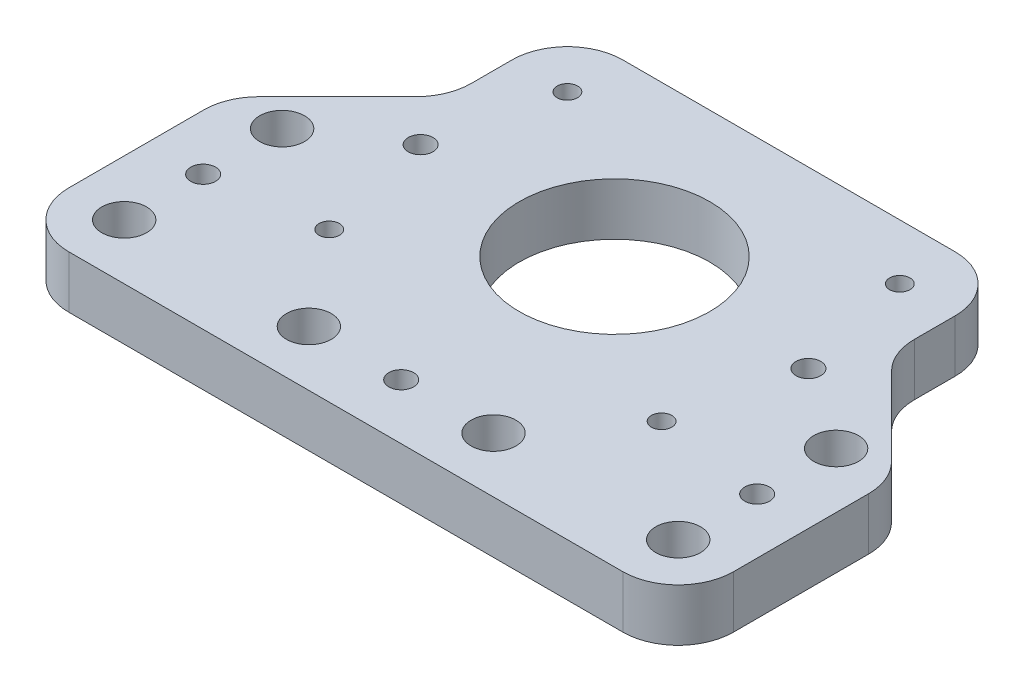
ISO-10303-21;
HEADER;
FILE_DESCRIPTION(('STEP AP214'),'2;1');
FILE_NAME('part.step','',(''),(''),'','','');
FILE_SCHEMA(('AUTOMOTIVE_DESIGN { 1 0 10303 214 1 1 1 1 }'));
ENDSEC;
DATA;
#1=APPLICATION_CONTEXT('core data for automotive mechanical design processes');
#2=APPLICATION_PROTOCOL_DEFINITION('international standard','automotive_design',2000,#1);
#3=PRODUCT_CONTEXT('',#1,'mechanical');
#4=PRODUCT('Part','Part','',(#3));
#5=PRODUCT_RELATED_PRODUCT_CATEGORY('part','',(#4));
#6=PRODUCT_DEFINITION_FORMATION('','',#4);
#7=PRODUCT_DEFINITION_CONTEXT('part definition',#1,'design');
#8=PRODUCT_DEFINITION('design','',#6,#7);
#9=PRODUCT_DEFINITION_SHAPE('','',#8);
#10=(LENGTH_UNIT() NAMED_UNIT(*) SI_UNIT(.MILLI.,.METRE.));
#11=(NAMED_UNIT(*) PLANE_ANGLE_UNIT() SI_UNIT($,.RADIAN.));
#12=(NAMED_UNIT(*) SI_UNIT($,.STERADIAN.) SOLID_ANGLE_UNIT());
#13=UNCERTAINTY_MEASURE_WITH_UNIT(LENGTH_MEASURE(1.E-05),#10,'distance_accuracy_value','');
#14=(GEOMETRIC_REPRESENTATION_CONTEXT(3) GLOBAL_UNCERTAINTY_ASSIGNED_CONTEXT((#13)) GLOBAL_UNIT_ASSIGNED_CONTEXT((#10,
#11,#12)) REPRESENTATION_CONTEXT('',''));
#15=CARTESIAN_POINT('',(0.,0.,0.));
#16=DIRECTION('',(0.,0.,1.));
#17=DIRECTION('',(1.,0.,0.));
#18=AXIS2_PLACEMENT_3D('',#15,#16,#17);
#19=CARTESIAN_POINT('',(0.,6.,-50.8));
#20=DIRECTION('',(0.,-1.,0.));
#21=DIRECTION('',(0.,0.,-1.));
#22=AXIS2_PLACEMENT_3D('',#19,#20,#21);
#23=PLANE('',#22);
#24=CARTESIAN_POINT('',(6.34999999999999,6.,-15.40002));
#25=DIRECTION('',(0.,-1.,0.));
#26=DIRECTION('',(0.,0.,-1.));
#27=AXIS2_PLACEMENT_3D('',#24,#25,#26);
#28=CIRCLE('',#27,1.42);
#29=CARTESIAN_POINT('',(6.34999999999999,6.,-16.82002));
#30=VERTEX_POINT('',#29);
#31=EDGE_CURVE('E276',#30,#30,#28,.T.);
#32=ORIENTED_EDGE('',*,*,#31,.T.);
#33=EDGE_LOOP('',(#32));
#34=FACE_BOUND('',#33,.T.);
#35=CARTESIAN_POINT('',(38.1,6.,-6.34999999999996));
#36=DIRECTION('',(0.,-1.,0.));
#37=DIRECTION('',(0.,0.,-1.));
#38=AXIS2_PLACEMENT_3D('',#35,#36,#37);
#39=CIRCLE('',#38,1.42);
#40=CARTESIAN_POINT('',(38.1,6.,-7.76999999999996));
#41=VERTEX_POINT('',#40);
#42=EDGE_CURVE('E283',#41,#41,#39,.T.);
#43=ORIENTED_EDGE('',*,*,#42,.T.);
#44=EDGE_LOOP('',(#43));
#45=FACE_BOUND('',#44,.T.);
#46=CARTESIAN_POINT('',(69.85,6.,-15.40002));
#47=DIRECTION('',(0.,-1.,0.));
#48=DIRECTION('',(0.,0.,-1.));
#49=AXIS2_PLACEMENT_3D('',#46,#47,#48);
#50=CIRCLE('',#49,1.42);
#51=CARTESIAN_POINT('',(69.85,6.,-16.82002));
#52=VERTEX_POINT('',#51);
#53=EDGE_CURVE('E289',#52,#52,#50,.T.);
#54=ORIENTED_EDGE('',*,*,#53,.T.);
#55=EDGE_LOOP('',(#54));
#56=FACE_BOUND('',#55,.T.);
#57=CARTESIAN_POINT('',(6.34999999999999,6.,-24.45004));
#58=DIRECTION('',(0.,-1.,0.));
#59=DIRECTION('',(0.,0.,-1.));
#60=AXIS2_PLACEMENT_3D('',#57,#58,#59);
#61=CIRCLE('',#60,2.57);
#62=CARTESIAN_POINT('',(6.34999999999999,6.,-27.02004));
#63=VERTEX_POINT('',#62);
#64=EDGE_CURVE('E295',#63,#63,#61,.T.);
#65=ORIENTED_EDGE('',*,*,#64,.T.);
#66=EDGE_LOOP('',(#65));
#67=FACE_BOUND('',#66,.T.);
#68=CARTESIAN_POINT('',(6.34999999999999,6.,-6.35));
#69=DIRECTION('',(0.,-1.,0.));
#70=DIRECTION('',(0.,0.,-1.));
#71=AXIS2_PLACEMENT_3D('',#68,#69,#70);
#72=CIRCLE('',#71,2.57);
#73=CARTESIAN_POINT('',(6.34999999999999,6.,-8.92));
#74=VERTEX_POINT('',#73);
#75=EDGE_CURVE('E302',#74,#74,#72,.T.);
#76=ORIENTED_EDGE('',*,*,#75,.T.);
#77=EDGE_LOOP('',(#76));
#78=FACE_BOUND('',#77,.T.);
#79=CARTESIAN_POINT('',(27.5166666666667,6.,-6.35));
#80=DIRECTION('',(0.,-1.,0.));
#81=DIRECTION('',(0.,0.,-1.));
#82=AXIS2_PLACEMENT_3D('',#79,#80,#81);
#83=CIRCLE('',#82,2.57);
#84=CARTESIAN_POINT('',(27.5166666666667,6.,-8.92));
#85=VERTEX_POINT('',#84);
#86=EDGE_CURVE('E308',#85,#85,#83,.T.);
#87=ORIENTED_EDGE('',*,*,#86,.T.);
#88=EDGE_LOOP('',(#87));
#89=FACE_BOUND('',#88,.T.);
#90=CARTESIAN_POINT('',(48.6833333333333,6.,-6.35));
#91=DIRECTION('',(0.,-1.,0.));
#92=DIRECTION('',(0.,0.,-1.));
#93=AXIS2_PLACEMENT_3D('',#90,#91,#92);
#94=CIRCLE('',#93,2.57);
#95=CARTESIAN_POINT('',(48.6833333333333,6.,-8.92));
#96=VERTEX_POINT('',#95);
#97=EDGE_CURVE('E314',#96,#96,#94,.T.);
#98=ORIENTED_EDGE('',*,*,#97,.T.);
#99=EDGE_LOOP('',(#98));
#100=FACE_BOUND('',#99,.T.);
#101=CARTESIAN_POINT('',(69.85,6.,-6.35));
#102=DIRECTION('',(0.,-1.,0.));
#103=DIRECTION('',(0.,0.,-1.));
#104=AXIS2_PLACEMENT_3D('',#101,#102,#103);
#105=CIRCLE('',#104,2.57);
#106=CARTESIAN_POINT('',(69.85,6.,-8.92));
#107=VERTEX_POINT('',#106);
#108=EDGE_CURVE('E320',#107,#107,#105,.T.);
#109=ORIENTED_EDGE('',*,*,#108,.T.);
#110=EDGE_LOOP('',(#109));
#111=FACE_BOUND('',#110,.T.);
#112=CARTESIAN_POINT('',(69.85,6.,-24.45004));
#113=DIRECTION('',(0.,-1.,0.));
#114=DIRECTION('',(0.,0.,-1.));
#115=AXIS2_PLACEMENT_3D('',#112,#113,#114);
#116=CIRCLE('',#115,2.57);
#117=CARTESIAN_POINT('',(69.85,6.,-27.02004));
#118=VERTEX_POINT('',#117);
#119=EDGE_CURVE('E326',#118,#118,#116,.T.);
#120=ORIENTED_EDGE('',*,*,#119,.T.);
#121=EDGE_LOOP('',(#120));
#122=FACE_BOUND('',#121,.T.);
#123=CARTESIAN_POINT('',(57.15,6.,-17.15));
#124=DIRECTION('',(0.,-1.,0.));
#125=DIRECTION('',(0.,0.,-1.));
#126=AXIS2_PLACEMENT_3D('',#123,#124,#125);
#127=CIRCLE('',#126,1.17);
#128=CARTESIAN_POINT('',(57.15,6.,-18.32));
#129=VERTEX_POINT('',#128);
#130=EDGE_CURVE('E332',#129,#129,#127,.T.);
#131=ORIENTED_EDGE('',*,*,#130,.T.);
#132=EDGE_LOOP('',(#131));
#133=FACE_BOUND('',#132,.T.);
#134=CARTESIAN_POINT('',(19.05,6.,-17.15));
#135=DIRECTION('',(0.,-1.,0.));
#136=DIRECTION('',(0.,0.,-1.));
#137=AXIS2_PLACEMENT_3D('',#134,#135,#136);
#138=CIRCLE('',#137,1.17);
#139=CARTESIAN_POINT('',(19.05,6.,-18.32));
#140=VERTEX_POINT('',#139);
#141=EDGE_CURVE('E338',#140,#140,#138,.T.);
#142=ORIENTED_EDGE('',*,*,#141,.T.);
#143=EDGE_LOOP('',(#142));
#144=FACE_BOUND('',#143,.T.);
#145=CARTESIAN_POINT('',(19.05,6.,-44.45));
#146=DIRECTION('',(0.,-1.,0.));
#147=DIRECTION('',(0.,0.,-1.));
#148=AXIS2_PLACEMENT_3D('',#145,#146,#147);
#149=CIRCLE('',#148,1.17);
#150=CARTESIAN_POINT('',(19.05,6.,-45.62));
#151=VERTEX_POINT('',#150);
#152=EDGE_CURVE('E344',#151,#151,#149,.T.);
#153=ORIENTED_EDGE('',*,*,#152,.T.);
#154=EDGE_LOOP('',(#153));
#155=FACE_BOUND('',#154,.T.);
#156=CARTESIAN_POINT('',(57.15,6.,-44.45));
#157=DIRECTION('',(0.,-1.,0.));
#158=DIRECTION('',(0.,0.,-1.));
#159=AXIS2_PLACEMENT_3D('',#156,#157,#158);
#160=CIRCLE('',#159,1.17);
#161=CARTESIAN_POINT('',(57.15,6.,-45.62));
#162=VERTEX_POINT('',#161);
#163=EDGE_CURVE('E350',#162,#162,#160,.T.);
#164=ORIENTED_EDGE('',*,*,#163,.T.);
#165=EDGE_LOOP('',(#164));
#166=FACE_BOUND('',#165,.T.);
#167=CARTESIAN_POINT('',(60.325,6.,-30.8));
#168=DIRECTION('',(0.,-1.,0.));
#169=DIRECTION('',(0.,0.,-1.));
#170=AXIS2_PLACEMENT_3D('',#167,#168,#169);
#171=CIRCLE('',#170,1.42);
#172=CARTESIAN_POINT('',(60.325,6.,-32.22));
#173=VERTEX_POINT('',#172);
#174=EDGE_CURVE('E353',#173,#173,#171,.F.);
#175=ORIENTED_EDGE('',*,*,#174,.F.);
#176=EDGE_LOOP('',(#175));
#177=FACE_BOUND('',#176,.T.);
#178=CARTESIAN_POINT('',(15.875,6.,-30.8));
#179=DIRECTION('',(0.,-1.,0.));
#180=DIRECTION('',(0.,0.,-1.));
#181=AXIS2_PLACEMENT_3D('',#178,#179,#180);
#182=CIRCLE('',#181,1.42);
#183=CARTESIAN_POINT('',(15.875,6.,-32.22));
#184=VERTEX_POINT('',#183);
#185=EDGE_CURVE('E39',#184,#184,#182,.F.);
#186=ORIENTED_EDGE('',*,*,#185,.F.);
#187=EDGE_LOOP('',(#186));
#188=FACE_BOUND('',#187,.T.);
#189=DIRECTION('',(0.707106781186549,0.,-0.707106781186546));
#190=VECTOR('',#189,1.);
#191=CARTESIAN_POINT('',(12.7,6.,-37.15));
#192=LINE('',#191,#190);
#193=CARTESIAN_POINT('',(1.85987193946543,6.,-26.3098719394655));
#194=VERTEX_POINT('',#193);
#195=CARTESIAN_POINT('',(10.8401280605346,6.,-35.2901280605346));
#196=VERTEX_POINT('',#195);
#197=EDGE_CURVE('E168',#194,#196,#192,.T.);
#198=ORIENTED_EDGE('',*,*,#197,.F.);
#199=CARTESIAN_POINT('',(6.35,6.,-21.8197438789309));
#200=DIRECTION('',(0.,-1.,0.));
#201=DIRECTION('',(0.,0.,-1.));
#202=AXIS2_PLACEMENT_3D('',#199,#200,#201);
#203=CIRCLE('',#202,6.35);
#204=CARTESIAN_POINT('',(0.,6.,-21.8197438789309));
#205=VERTEX_POINT('',#204);
#206=EDGE_CURVE('E151',#194,#205,#203,.F.);
#207=ORIENTED_EDGE('',*,*,#206,.T.);
#208=DIRECTION('',(0.,0.,1.));
#209=VECTOR('',#208,1.);
#210=CARTESIAN_POINT('',(0.,6.,0.));
#211=LINE('',#210,#209);
#212=CARTESIAN_POINT('',(0.,6.,-6.35));
#213=VERTEX_POINT('',#212);
#214=EDGE_CURVE('E190',#205,#213,#211,.T.);
#215=ORIENTED_EDGE('',*,*,#214,.T.);
#216=CARTESIAN_POINT('',(6.35,6.,-6.35));
#217=DIRECTION('',(0.,-1.,0.));
#218=DIRECTION('',(0.,0.,-1.));
#219=AXIS2_PLACEMENT_3D('',#216,#217,#218);
#220=CIRCLE('',#219,6.35);
#221=CARTESIAN_POINT('',(6.35,6.,0.));
#222=VERTEX_POINT('',#221);
#223=EDGE_CURVE('E172',#213,#222,#220,.F.);
#224=ORIENTED_EDGE('',*,*,#223,.T.);
#225=DIRECTION('',(1.,0.,0.));
#226=VECTOR('',#225,1.);
#227=CARTESIAN_POINT('',(0.,6.,0.));
#228=LINE('',#227,#226);
#229=CARTESIAN_POINT('',(69.85,6.,0.));
#230=VERTEX_POINT('',#229);
#231=EDGE_CURVE('E192',#222,#230,#228,.T.);
#232=ORIENTED_EDGE('',*,*,#231,.T.);
#233=CARTESIAN_POINT('',(69.85,6.,-6.35));
#234=DIRECTION('',(0.,-1.,0.));
#235=DIRECTION('',(0.,0.,-1.));
#236=AXIS2_PLACEMENT_3D('',#233,#234,#235);
#237=CIRCLE('',#236,6.35);
#238=CARTESIAN_POINT('',(76.2,6.,-6.35));
#239=VERTEX_POINT('',#238);
#240=EDGE_CURVE('E216',#230,#239,#237,.F.);
#241=ORIENTED_EDGE('',*,*,#240,.T.);
#242=DIRECTION('',(0.,0.,-1.));
#243=VECTOR('',#242,1.);
#244=CARTESIAN_POINT('',(76.2,6.,-50.8));
#245=LINE('',#244,#243);
#246=CARTESIAN_POINT('',(76.2,6.,-21.8197438789309));
#247=VERTEX_POINT('',#246);
#248=EDGE_CURVE('E196',#239,#247,#245,.T.);
#249=ORIENTED_EDGE('',*,*,#248,.T.);
#250=CARTESIAN_POINT('',(69.85,6.,-21.8197438789309));
#251=DIRECTION('',(0.,-1.,0.));
#252=DIRECTION('',(0.,0.,-1.));
#253=AXIS2_PLACEMENT_3D('',#250,#251,#252);
#254=CIRCLE('',#253,6.35);
#255=CARTESIAN_POINT('',(74.3401280605346,6.,-26.3098719394655));
#256=VERTEX_POINT('',#255);
#257=EDGE_CURVE('E162',#247,#256,#254,.F.);
#258=ORIENTED_EDGE('',*,*,#257,.T.);
#259=DIRECTION('',(0.707106781186549,0.,0.707106781186546));
#260=VECTOR('',#259,1.);
#261=CARTESIAN_POINT('',(76.2,6.,-24.4500000000001));
#262=LINE('',#261,#260);
#263=CARTESIAN_POINT('',(65.3598719394654,6.,-35.2901280605346));
#264=VERTEX_POINT('',#263);
#265=EDGE_CURVE('E550',#264,#256,#262,.T.);
#266=ORIENTED_EDGE('',*,*,#265,.F.);
#267=CARTESIAN_POINT('',(69.85,6.,-39.7802561210692));
#268=DIRECTION('',(0.,-1.,0.));
#269=DIRECTION('',(0.,0.,-1.));
#270=AXIS2_PLACEMENT_3D('',#267,#268,#269);
#271=CIRCLE('',#270,6.35);
#272=CARTESIAN_POINT('',(63.5,6.,-39.7802561210692));
#273=VERTEX_POINT('',#272);
#274=EDGE_CURVE('E44',#264,#273,#271,.T.);
#275=ORIENTED_EDGE('',*,*,#274,.T.);
#276=DIRECTION('',(0.,0.,1.));
#277=VECTOR('',#276,1.);
#278=CARTESIAN_POINT('',(63.5,6.,-50.8));
#279=LINE('',#278,#277);
#280=CARTESIAN_POINT('',(63.5,6.,-44.45));
#281=VERTEX_POINT('',#280);
#282=EDGE_CURVE('E292',#281,#273,#279,.T.);
#283=ORIENTED_EDGE('',*,*,#282,.F.);
#284=CARTESIAN_POINT('',(57.15,6.,-44.45));
#285=DIRECTION('',(0.,-1.,0.));
#286=DIRECTION('',(0.,0.,-1.));
#287=AXIS2_PLACEMENT_3D('',#284,#285,#286);
#288=CIRCLE('',#287,6.35);
#289=CARTESIAN_POINT('',(57.15,6.,-50.8));
#290=VERTEX_POINT('',#289);
#291=EDGE_CURVE('E220',#281,#290,#288,.F.);
#292=ORIENTED_EDGE('',*,*,#291,.T.);
#293=DIRECTION('',(-1.,0.,0.));
#294=VECTOR('',#293,1.);
#295=CARTESIAN_POINT('',(38.1,6.,-50.8));
#296=LINE('',#295,#294);
#297=CARTESIAN_POINT('',(19.05,6.,-50.8));
#298=VERTEX_POINT('',#297);
#299=EDGE_CURVE('E199',#290,#298,#296,.T.);
#300=ORIENTED_EDGE('',*,*,#299,.T.);
#301=CARTESIAN_POINT('',(19.05,6.,-44.45));
#302=DIRECTION('',(0.,-1.,0.));
#303=DIRECTION('',(0.,0.,-1.));
#304=AXIS2_PLACEMENT_3D('',#301,#302,#303);
#305=CIRCLE('',#304,6.35);
#306=CARTESIAN_POINT('',(12.7,6.,-44.45));
#307=VERTEX_POINT('',#306);
#308=EDGE_CURVE('E218',#298,#307,#305,.F.);
#309=ORIENTED_EDGE('',*,*,#308,.T.);
#310=DIRECTION('',(0.,0.,-1.));
#311=VECTOR('',#310,1.);
#312=CARTESIAN_POINT('',(12.7,6.,-50.8));
#313=LINE('',#312,#311);
#314=CARTESIAN_POINT('',(12.7,6.,-39.7802561210692));
#315=VERTEX_POINT('',#314);
#316=EDGE_CURVE('E178',#315,#307,#313,.T.);
#317=ORIENTED_EDGE('',*,*,#316,.F.);
#318=CARTESIAN_POINT('',(6.35,6.,-39.7802561210692));
#319=DIRECTION('',(0.,-1.,0.));
#320=DIRECTION('',(0.,0.,-1.));
#321=AXIS2_PLACEMENT_3D('',#318,#319,#320);
#322=CIRCLE('',#321,6.35);
#323=EDGE_CURVE('E177',#315,#196,#322,.T.);
#324=ORIENTED_EDGE('',*,*,#323,.T.);
#325=EDGE_LOOP('',(#198,#207,#215,#224,#232,#241,#249,#258,#266,#275,#283,#292,#300,#309,#317,#324));
#326=FACE_BOUND('',#325,.T.);
#327=CARTESIAN_POINT('',(38.1,6.,-30.8));
#328=DIRECTION('',(0.,-1.,0.));
#329=DIRECTION('',(0.,0.,-1.));
#330=AXIS2_PLACEMENT_3D('',#327,#328,#329);
#331=CIRCLE('',#330,10.92);
#332=CARTESIAN_POINT('',(38.1,6.,-41.72));
#333=VERTEX_POINT('',#332);
#334=EDGE_CURVE('E206',#333,#333,#331,.F.);
#335=ORIENTED_EDGE('',*,*,#334,.F.);
#336=EDGE_LOOP('',(#335));
#337=FACE_BOUND('',#336,.T.);
#338=ADVANCED_FACE('F35',(#34,#45,#56,#67,#78,#89,#100,#111,#122,#133,#144,#155,#166,#177,#188,
#326,#337),#23,.F.);
#339=CARTESIAN_POINT('',(0.,0.,-50.8));
#340=DIRECTION('',(0.,-1.,0.));
#341=DIRECTION('',(0.,0.,-1.));
#342=AXIS2_PLACEMENT_3D('',#339,#340,#341);
#343=PLANE('',#342);
#344=CARTESIAN_POINT('',(6.34999999999999,0.,-15.40002));
#345=DIRECTION('',(0.,-1.,0.));
#346=DIRECTION('',(0.,0.,-1.));
#347=AXIS2_PLACEMENT_3D('',#344,#345,#346);
#348=CIRCLE('',#347,1.42);
#349=CARTESIAN_POINT('',(6.34999999999999,0.,-16.82002));
#350=VERTEX_POINT('',#349);
#351=EDGE_CURVE('E280',#350,#350,#348,.T.);
#352=ORIENTED_EDGE('',*,*,#351,.F.);
#353=EDGE_LOOP('',(#352));
#354=FACE_BOUND('',#353,.T.);
#355=CARTESIAN_POINT('',(38.1,0.,-6.34999999999996));
#356=DIRECTION('',(0.,-1.,0.));
#357=DIRECTION('',(0.,0.,-1.));
#358=AXIS2_PLACEMENT_3D('',#355,#356,#357);
#359=CIRCLE('',#358,1.42);
#360=CARTESIAN_POINT('',(38.1,0.,-7.76999999999996));
#361=VERTEX_POINT('',#360);
#362=EDGE_CURVE('E279',#361,#361,#359,.T.);
#363=ORIENTED_EDGE('',*,*,#362,.F.);
#364=EDGE_LOOP('',(#363));
#365=FACE_BOUND('',#364,.T.);
#366=CARTESIAN_POINT('',(69.85,0.,-15.40002));
#367=DIRECTION('',(0.,-1.,0.));
#368=DIRECTION('',(0.,0.,-1.));
#369=AXIS2_PLACEMENT_3D('',#366,#367,#368);
#370=CIRCLE('',#369,1.42);
#371=CARTESIAN_POINT('',(69.85,0.,-16.82002));
#372=VERTEX_POINT('',#371);
#373=EDGE_CURVE('E286',#372,#372,#370,.T.);
#374=ORIENTED_EDGE('',*,*,#373,.F.);
#375=EDGE_LOOP('',(#374));
#376=FACE_BOUND('',#375,.T.);
#377=DIRECTION('',(0.,0.,1.));
#378=VECTOR('',#377,1.);
#379=CARTESIAN_POINT('',(0.,0.,0.));
#380=LINE('',#379,#378);
#381=CARTESIAN_POINT('',(0.,0.,-21.8197438789309));
#382=VERTEX_POINT('',#381);
#383=CARTESIAN_POINT('',(0.,0.,-6.35));
#384=VERTEX_POINT('',#383);
#385=EDGE_CURVE('E202',#382,#384,#380,.T.);
#386=ORIENTED_EDGE('',*,*,#385,.F.);
#387=CARTESIAN_POINT('',(6.35,0.,-21.8197438789309));
#388=DIRECTION('',(0.,-1.,0.));
#389=DIRECTION('',(0.,0.,-1.));
#390=AXIS2_PLACEMENT_3D('',#387,#388,#389);
#391=CIRCLE('',#390,6.35);
#392=CARTESIAN_POINT('',(1.85987193946543,0.,-26.3098719394655));
#393=VERTEX_POINT('',#392);
#394=EDGE_CURVE('E234',#382,#393,#391,.T.);
#395=ORIENTED_EDGE('',*,*,#394,.T.);
#396=DIRECTION('',(0.707106781186549,0.,-0.707106781186546));
#397=VECTOR('',#396,1.);
#398=CARTESIAN_POINT('',(12.7,0.,-37.15));
#399=LINE('',#398,#397);
#400=CARTESIAN_POINT('',(10.8401280605346,0.,-35.2901280605346));
#401=VERTEX_POINT('',#400);
#402=EDGE_CURVE('E171',#393,#401,#399,.T.);
#403=ORIENTED_EDGE('',*,*,#402,.T.);
#404=CARTESIAN_POINT('',(6.35,0.,-39.7802561210692));
#405=DIRECTION('',(0.,-1.,0.));
#406=DIRECTION('',(0.,0.,-1.));
#407=AXIS2_PLACEMENT_3D('',#404,#405,#406);
#408=CIRCLE('',#407,6.35);
#409=CARTESIAN_POINT('',(12.7,0.,-39.7802561210692));
#410=VERTEX_POINT('',#409);
#411=EDGE_CURVE('E267',#401,#410,#408,.F.);
#412=ORIENTED_EDGE('',*,*,#411,.T.);
#413=DIRECTION('',(0.,0.,-1.));
#414=VECTOR('',#413,1.);
#415=CARTESIAN_POINT('',(12.7,0.,-50.8));
#416=LINE('',#415,#414);
#417=CARTESIAN_POINT('',(12.7,0.,-44.45));
#418=VERTEX_POINT('',#417);
#419=EDGE_CURVE('E187',#410,#418,#416,.T.);
#420=ORIENTED_EDGE('',*,*,#419,.T.);
#421=CARTESIAN_POINT('',(19.05,0.,-44.45));
#422=DIRECTION('',(0.,-1.,0.));
#423=DIRECTION('',(0.,0.,-1.));
#424=AXIS2_PLACEMENT_3D('',#421,#422,#423);
#425=CIRCLE('',#424,6.35);
#426=CARTESIAN_POINT('',(19.05,0.,-50.8));
#427=VERTEX_POINT('',#426);
#428=EDGE_CURVE('E229',#418,#427,#425,.T.);
#429=ORIENTED_EDGE('',*,*,#428,.T.);
#430=DIRECTION('',(-1.,0.,0.));
#431=VECTOR('',#430,1.);
#432=CARTESIAN_POINT('',(0.,0.,-50.8));
#433=LINE('',#432,#431);
#434=CARTESIAN_POINT('',(57.15,0.,-50.8));
#435=VERTEX_POINT('',#434);
#436=EDGE_CURVE('E193',#435,#427,#433,.T.);
#437=ORIENTED_EDGE('',*,*,#436,.F.);
#438=CARTESIAN_POINT('',(57.15,0.,-44.45));
#439=DIRECTION('',(0.,-1.,0.));
#440=DIRECTION('',(0.,0.,-1.));
#441=AXIS2_PLACEMENT_3D('',#438,#439,#440);
#442=CIRCLE('',#441,6.35);
#443=CARTESIAN_POINT('',(63.5,0.,-44.45));
#444=VERTEX_POINT('',#443);
#445=EDGE_CURVE('E59',#435,#444,#442,.T.);
#446=ORIENTED_EDGE('',*,*,#445,.T.);
#447=DIRECTION('',(0.,0.,1.));
#448=VECTOR('',#447,1.);
#449=CARTESIAN_POINT('',(63.5,0.,-50.8));
#450=LINE('',#449,#448);
#451=CARTESIAN_POINT('',(63.5,0.,-39.7802561210692));
#452=VERTEX_POINT('',#451);
#453=EDGE_CURVE('E184',#444,#452,#450,.T.);
#454=ORIENTED_EDGE('',*,*,#453,.T.);
#455=CARTESIAN_POINT('',(69.85,0.,-39.7802561210692));
#456=DIRECTION('',(0.,-1.,0.));
#457=DIRECTION('',(0.,0.,-1.));
#458=AXIS2_PLACEMENT_3D('',#455,#456,#457);
#459=CIRCLE('',#458,6.35);
#460=CARTESIAN_POINT('',(65.3598719394654,0.,-35.2901280605346));
#461=VERTEX_POINT('',#460);
#462=EDGE_CURVE('E12',#452,#461,#459,.F.);
#463=ORIENTED_EDGE('',*,*,#462,.T.);
#464=DIRECTION('',(0.707106781186549,0.,0.707106781186546));
#465=VECTOR('',#464,1.);
#466=CARTESIAN_POINT('',(76.2,0.,-24.4500000000001));
#467=LINE('',#466,#465);
#468=CARTESIAN_POINT('',(74.3401280605346,0.,-26.3098719394655));
#469=VERTEX_POINT('',#468);
#470=EDGE_CURVE('E179',#461,#469,#467,.T.);
#471=ORIENTED_EDGE('',*,*,#470,.T.);
#472=CARTESIAN_POINT('',(69.85,0.,-21.8197438789309));
#473=DIRECTION('',(0.,-1.,0.));
#474=DIRECTION('',(0.,0.,-1.));
#475=AXIS2_PLACEMENT_3D('',#472,#473,#474);
#476=CIRCLE('',#475,6.35);
#477=CARTESIAN_POINT('',(76.2,0.,-21.8197438789309));
#478=VERTEX_POINT('',#477);
#479=EDGE_CURVE('E232',#469,#478,#476,.T.);
#480=ORIENTED_EDGE('',*,*,#479,.T.);
#481=DIRECTION('',(0.,0.,-1.));
#482=VECTOR('',#481,1.);
#483=CARTESIAN_POINT('',(76.2,0.,-50.8));
#484=LINE('',#483,#482);
#485=CARTESIAN_POINT('',(76.2,0.,-6.35));
#486=VERTEX_POINT('',#485);
#487=EDGE_CURVE('E209',#486,#478,#484,.T.);
#488=ORIENTED_EDGE('',*,*,#487,.F.);
#489=CARTESIAN_POINT('',(69.85,0.,-6.35));
#490=DIRECTION('',(0.,-1.,0.));
#491=DIRECTION('',(0.,0.,-1.));
#492=AXIS2_PLACEMENT_3D('',#489,#490,#491);
#493=CIRCLE('',#492,6.35);
#494=CARTESIAN_POINT('',(69.85,0.,0.));
#495=VERTEX_POINT('',#494);
#496=EDGE_CURVE('E227',#486,#495,#493,.T.);
#497=ORIENTED_EDGE('',*,*,#496,.T.);
#498=DIRECTION('',(1.,0.,0.));
#499=VECTOR('',#498,1.);
#500=CARTESIAN_POINT('',(0.,0.,0.));
#501=LINE('',#500,#499);
#502=CARTESIAN_POINT('',(6.35,0.,0.));
#503=VERTEX_POINT('',#502);
#504=EDGE_CURVE('E205',#503,#495,#501,.T.);
#505=ORIENTED_EDGE('',*,*,#504,.F.);
#506=CARTESIAN_POINT('',(6.35,0.,-6.35));
#507=DIRECTION('',(0.,-1.,0.));
#508=DIRECTION('',(0.,0.,-1.));
#509=AXIS2_PLACEMENT_3D('',#506,#507,#508);
#510=CIRCLE('',#509,6.35);
#511=EDGE_CURVE('E225',#503,#384,#510,.T.);
#512=ORIENTED_EDGE('',*,*,#511,.T.);
#513=EDGE_LOOP('',(#386,#395,#403,#412,#420,#429,#437,#446,#454,#463,#471,#480,#488,#497,#505,#512));
#514=FACE_BOUND('',#513,.T.);
#515=CARTESIAN_POINT('',(6.34999999999999,0.,-24.45004));
#516=DIRECTION('',(0.,-1.,0.));
#517=DIRECTION('',(0.,0.,-1.));
#518=AXIS2_PLACEMENT_3D('',#515,#516,#517);
#519=CIRCLE('',#518,2.57);
#520=CARTESIAN_POINT('',(6.34999999999999,0.,-27.02004));
#521=VERTEX_POINT('',#520);
#522=EDGE_CURVE('E299',#521,#521,#519,.T.);
#523=ORIENTED_EDGE('',*,*,#522,.F.);
#524=EDGE_LOOP('',(#523));
#525=FACE_BOUND('',#524,.T.);
#526=CARTESIAN_POINT('',(6.34999999999999,0.,-6.35));
#527=DIRECTION('',(0.,-1.,0.));
#528=DIRECTION('',(0.,0.,-1.));
#529=AXIS2_PLACEMENT_3D('',#526,#527,#528);
#530=CIRCLE('',#529,2.57);
#531=CARTESIAN_POINT('',(6.34999999999999,0.,-8.92));
#532=VERTEX_POINT('',#531);
#533=EDGE_CURVE('E298',#532,#532,#530,.T.);
#534=ORIENTED_EDGE('',*,*,#533,.F.);
#535=EDGE_LOOP('',(#534));
#536=FACE_BOUND('',#535,.T.);
#537=CARTESIAN_POINT('',(27.5166666666667,0.,-6.35));
#538=DIRECTION('',(0.,-1.,0.));
#539=DIRECTION('',(0.,0.,-1.));
#540=AXIS2_PLACEMENT_3D('',#537,#538,#539);
#541=CIRCLE('',#540,2.57);
#542=CARTESIAN_POINT('',(27.5166666666667,0.,-8.92));
#543=VERTEX_POINT('',#542);
#544=EDGE_CURVE('E305',#543,#543,#541,.T.);
#545=ORIENTED_EDGE('',*,*,#544,.F.);
#546=EDGE_LOOP('',(#545));
#547=FACE_BOUND('',#546,.T.);
#548=CARTESIAN_POINT('',(48.6833333333333,0.,-6.35));
#549=DIRECTION('',(0.,-1.,0.));
#550=DIRECTION('',(0.,0.,-1.));
#551=AXIS2_PLACEMENT_3D('',#548,#549,#550);
#552=CIRCLE('',#551,2.57);
#553=CARTESIAN_POINT('',(48.6833333333333,0.,-8.92));
#554=VERTEX_POINT('',#553);
#555=EDGE_CURVE('E311',#554,#554,#552,.T.);
#556=ORIENTED_EDGE('',*,*,#555,.F.);
#557=EDGE_LOOP('',(#556));
#558=FACE_BOUND('',#557,.T.);
#559=CARTESIAN_POINT('',(69.85,0.,-6.35));
#560=DIRECTION('',(0.,-1.,0.));
#561=DIRECTION('',(0.,0.,-1.));
#562=AXIS2_PLACEMENT_3D('',#559,#560,#561);
#563=CIRCLE('',#562,2.57);
#564=CARTESIAN_POINT('',(69.85,0.,-8.92));
#565=VERTEX_POINT('',#564);
#566=EDGE_CURVE('E317',#565,#565,#563,.T.);
#567=ORIENTED_EDGE('',*,*,#566,.F.);
#568=EDGE_LOOP('',(#567));
#569=FACE_BOUND('',#568,.T.);
#570=CARTESIAN_POINT('',(69.85,0.,-24.45004));
#571=DIRECTION('',(0.,-1.,0.));
#572=DIRECTION('',(0.,0.,-1.));
#573=AXIS2_PLACEMENT_3D('',#570,#571,#572);
#574=CIRCLE('',#573,2.57);
#575=CARTESIAN_POINT('',(69.85,0.,-27.02004));
#576=VERTEX_POINT('',#575);
#577=EDGE_CURVE('E323',#576,#576,#574,.T.);
#578=ORIENTED_EDGE('',*,*,#577,.F.);
#579=EDGE_LOOP('',(#578));
#580=FACE_BOUND('',#579,.T.);
#581=CARTESIAN_POINT('',(57.15,0.,-17.15));
#582=DIRECTION('',(0.,-1.,0.));
#583=DIRECTION('',(0.,0.,-1.));
#584=AXIS2_PLACEMENT_3D('',#581,#582,#583);
#585=CIRCLE('',#584,1.17);
#586=CARTESIAN_POINT('',(57.15,0.,-18.32));
#587=VERTEX_POINT('',#586);
#588=EDGE_CURVE('E329',#587,#587,#585,.T.);
#589=ORIENTED_EDGE('',*,*,#588,.F.);
#590=EDGE_LOOP('',(#589));
#591=FACE_BOUND('',#590,.T.);
#592=CARTESIAN_POINT('',(19.05,0.,-17.15));
#593=DIRECTION('',(0.,-1.,0.));
#594=DIRECTION('',(0.,0.,-1.));
#595=AXIS2_PLACEMENT_3D('',#592,#593,#594);
#596=CIRCLE('',#595,1.17);
#597=CARTESIAN_POINT('',(19.05,0.,-18.32));
#598=VERTEX_POINT('',#597);
#599=EDGE_CURVE('E335',#598,#598,#596,.T.);
#600=ORIENTED_EDGE('',*,*,#599,.F.);
#601=EDGE_LOOP('',(#600));
#602=FACE_BOUND('',#601,.T.);
#603=CARTESIAN_POINT('',(19.05,0.,-44.45));
#604=DIRECTION('',(0.,-1.,0.));
#605=DIRECTION('',(0.,0.,-1.));
#606=AXIS2_PLACEMENT_3D('',#603,#604,#605);
#607=CIRCLE('',#606,1.17);
#608=CARTESIAN_POINT('',(19.05,0.,-45.62));
#609=VERTEX_POINT('',#608);
#610=EDGE_CURVE('E341',#609,#609,#607,.T.);
#611=ORIENTED_EDGE('',*,*,#610,.F.);
#612=EDGE_LOOP('',(#611));
#613=FACE_BOUND('',#612,.T.);
#614=CARTESIAN_POINT('',(57.15,0.,-44.45));
#615=DIRECTION('',(0.,-1.,0.));
#616=DIRECTION('',(0.,0.,-1.));
#617=AXIS2_PLACEMENT_3D('',#614,#615,#616);
#618=CIRCLE('',#617,1.17);
#619=CARTESIAN_POINT('',(57.15,0.,-45.62));
#620=VERTEX_POINT('',#619);
#621=EDGE_CURVE('E347',#620,#620,#618,.T.);
#622=ORIENTED_EDGE('',*,*,#621,.F.);
#623=EDGE_LOOP('',(#622));
#624=FACE_BOUND('',#623,.T.);
#625=CARTESIAN_POINT('',(60.325,0.,-30.8));
#626=DIRECTION('',(0.,-1.,0.));
#627=DIRECTION('',(0.,0.,-1.));
#628=AXIS2_PLACEMENT_3D('',#625,#626,#627);
#629=CIRCLE('',#628,1.42);
#630=CARTESIAN_POINT('',(60.325,0.,-32.22));
#631=VERTEX_POINT('',#630);
#632=EDGE_CURVE('E356',#631,#631,#629,.F.);
#633=ORIENTED_EDGE('',*,*,#632,.T.);
#634=EDGE_LOOP('',(#633));
#635=FACE_BOUND('',#634,.T.);
#636=CARTESIAN_POINT('',(15.875,0.,-30.8));
#637=DIRECTION('',(0.,-1.,0.));
#638=DIRECTION('',(0.,0.,-1.));
#639=AXIS2_PLACEMENT_3D('',#636,#637,#638);
#640=CIRCLE('',#639,1.42);
#641=CARTESIAN_POINT('',(15.875,0.,-32.22));
#642=VERTEX_POINT('',#641);
#643=EDGE_CURVE('E275',#642,#642,#640,.F.);
#644=ORIENTED_EDGE('',*,*,#643,.T.);
#645=EDGE_LOOP('',(#644));
#646=FACE_BOUND('',#645,.T.);
#647=CARTESIAN_POINT('',(38.1,0.,-30.8));
#648=DIRECTION('',(0.,-1.,0.));
#649=DIRECTION('',(0.,0.,-1.));
#650=AXIS2_PLACEMENT_3D('',#647,#648,#649);
#651=CIRCLE('',#650,10.92);
#652=CARTESIAN_POINT('',(38.1,0.,-41.72));
#653=VERTEX_POINT('',#652);
#654=EDGE_CURVE('E272',#653,#653,#651,.F.);
#655=ORIENTED_EDGE('',*,*,#654,.T.);
#656=EDGE_LOOP('',(#655));
#657=FACE_BOUND('',#656,.T.);
#658=ADVANCED_FACE('F369',(#354,#365,#376,#514,#525,#536,#547,#558,#569,#580,#591,#602,#613,
#624,#635,#646,#657),#343,.T.);
#659=CARTESIAN_POINT('',(0.,6.,0.));
#660=DIRECTION('',(1.,0.,0.));
#661=DIRECTION('',(0.,0.,-1.));
#662=AXIS2_PLACEMENT_3D('',#659,#660,#661);
#663=PLANE('',#662);
#664=ORIENTED_EDGE('',*,*,#214,.F.);
#665=DIRECTION('',(0.,1.,0.));
#666=VECTOR('',#665,1.);
#667=CARTESIAN_POINT('',(0.,6.,-21.8197438789309));
#668=LINE('',#667,#666);
#669=EDGE_CURVE('E156',#205,#382,#668,.F.);
#670=ORIENTED_EDGE('',*,*,#669,.T.);
#671=ORIENTED_EDGE('',*,*,#385,.T.);
#672=DIRECTION('',(0.,-1.,0.));
#673=VECTOR('',#672,1.);
#674=CARTESIAN_POINT('',(0.,6.,-6.35));
#675=LINE('',#674,#673);
#676=EDGE_CURVE('E161',#384,#213,#675,.F.);
#677=ORIENTED_EDGE('',*,*,#676,.T.);
#678=EDGE_LOOP('',(#664,#670,#671,#677));
#679=FACE_BOUND('',#678,.T.);
#680=ADVANCED_FACE('F375',(#679),#663,.F.);
#681=CARTESIAN_POINT('',(0.,6.,0.));
#682=DIRECTION('',(0.,0.,-1.));
#683=DIRECTION('',(-1.,0.,0.));
#684=AXIS2_PLACEMENT_3D('',#681,#682,#683);
#685=PLANE('',#684);
#686=ORIENTED_EDGE('',*,*,#504,.T.);
#687=DIRECTION('',(0.,-1.,0.));
#688=VECTOR('',#687,1.);
#689=CARTESIAN_POINT('',(69.85,6.,0.));
#690=LINE('',#689,#688);
#691=EDGE_CURVE('E264',#495,#230,#690,.F.);
#692=ORIENTED_EDGE('',*,*,#691,.T.);
#693=ORIENTED_EDGE('',*,*,#231,.F.);
#694=DIRECTION('',(0.,-1.,0.));
#695=VECTOR('',#694,1.);
#696=CARTESIAN_POINT('',(6.35,6.,0.));
#697=LINE('',#696,#695);
#698=EDGE_CURVE('E261',#222,#503,#697,.T.);
#699=ORIENTED_EDGE('',*,*,#698,.T.);
#700=EDGE_LOOP('',(#686,#692,#693,#699));
#701=FACE_BOUND('',#700,.T.);
#702=ADVANCED_FACE('F390',(#701),#685,.F.);
#703=CARTESIAN_POINT('',(76.2,6.,-50.8));
#704=DIRECTION('',(-1.,0.,0.));
#705=DIRECTION('',(0.,0.,1.));
#706=AXIS2_PLACEMENT_3D('',#703,#704,#705);
#707=PLANE('',#706);
#708=ORIENTED_EDGE('',*,*,#487,.T.);
#709=DIRECTION('',(0.,1.,0.));
#710=VECTOR('',#709,1.);
#711=CARTESIAN_POINT('',(76.2,6.,-21.8197438789309));
#712=LINE('',#711,#710);
#713=EDGE_CURVE('E244',#478,#247,#712,.T.);
#714=ORIENTED_EDGE('',*,*,#713,.T.);
#715=ORIENTED_EDGE('',*,*,#248,.F.);
#716=DIRECTION('',(0.,-1.,0.));
#717=VECTOR('',#716,1.);
#718=CARTESIAN_POINT('',(76.2,6.,-6.35));
#719=LINE('',#718,#717);
#720=EDGE_CURVE('E241',#239,#486,#719,.T.);
#721=ORIENTED_EDGE('',*,*,#720,.T.);
#722=EDGE_LOOP('',(#708,#714,#715,#721));
#723=FACE_BOUND('',#722,.T.);
#724=ADVANCED_FACE('F386',(#723),#707,.F.);
#725=CARTESIAN_POINT('',(0.,6.,-50.8));
#726=DIRECTION('',(0.,0.,1.));
#727=DIRECTION('',(1.,0.,0.));
#728=AXIS2_PLACEMENT_3D('',#725,#726,#727);
#729=PLANE('',#728);
#730=ORIENTED_EDGE('',*,*,#299,.F.);
#731=DIRECTION('',(0.,1.,0.));
#732=VECTOR('',#731,1.);
#733=CARTESIAN_POINT('',(57.15,6.,-50.8));
#734=LINE('',#733,#732);
#735=EDGE_CURVE('E259',#290,#435,#734,.F.);
#736=ORIENTED_EDGE('',*,*,#735,.T.);
#737=ORIENTED_EDGE('',*,*,#436,.T.);
#738=DIRECTION('',(0.,1.,0.));
#739=VECTOR('',#738,1.);
#740=CARTESIAN_POINT('',(19.05,6.,-50.8));
#741=LINE('',#740,#739);
#742=EDGE_CURVE('E256',#427,#298,#741,.T.);
#743=ORIENTED_EDGE('',*,*,#742,.T.);
#744=EDGE_LOOP('',(#730,#736,#737,#743));
#745=FACE_BOUND('',#744,.T.);
#746=ADVANCED_FACE('F382',(#745),#729,.F.);
#747=CARTESIAN_POINT('',(38.1,6.,-30.8));
#748=DIRECTION('',(0.,-1.,0.));
#749=DIRECTION('',(0.,0.,-1.));
#750=AXIS2_PLACEMENT_3D('',#747,#748,#749);
#751=CYLINDRICAL_SURFACE('',#750,10.92);
#752=ORIENTED_EDGE('',*,*,#334,.T.);
#753=EDGE_LOOP('',(#752));
#754=FACE_BOUND('',#753,.T.);
#755=ORIENTED_EDGE('',*,*,#654,.F.);
#756=EDGE_LOOP('',(#755));
#757=FACE_BOUND('',#756,.T.);
#758=ADVANCED_FACE('F385',(#754,#757),#751,.F.);
#759=CARTESIAN_POINT('',(15.875,0.,-30.8));
#760=DIRECTION('',(0.,1.,0.));
#761=DIRECTION('',(0.,0.,1.));
#762=AXIS2_PLACEMENT_3D('',#759,#760,#761);
#763=CYLINDRICAL_SURFACE('',#762,1.42);
#764=ORIENTED_EDGE('',*,*,#643,.F.);
#765=EDGE_LOOP('',(#764));
#766=FACE_BOUND('',#765,.T.);
#767=ORIENTED_EDGE('',*,*,#185,.T.);
#768=EDGE_LOOP('',(#767));
#769=FACE_BOUND('',#768,.T.);
#770=ADVANCED_FACE('F366',(#766,#769),#763,.F.);
#771=CARTESIAN_POINT('',(60.325,0.,-30.8));
#772=DIRECTION('',(0.,1.,0.));
#773=DIRECTION('',(0.,0.,1.));
#774=AXIS2_PLACEMENT_3D('',#771,#772,#773);
#775=CYLINDRICAL_SURFACE('',#774,1.42);
#776=ORIENTED_EDGE('',*,*,#632,.F.);
#777=EDGE_LOOP('',(#776));
#778=FACE_BOUND('',#777,.T.);
#779=ORIENTED_EDGE('',*,*,#174,.T.);
#780=EDGE_LOOP('',(#779));
#781=FACE_BOUND('',#780,.T.);
#782=ADVANCED_FACE('F435',(#778,#781),#775,.F.);
#783=CARTESIAN_POINT('',(57.15,6.,-44.45));
#784=DIRECTION('',(0.,-1.,0.));
#785=DIRECTION('',(0.,0.,-1.));
#786=AXIS2_PLACEMENT_3D('',#783,#784,#785);
#787=CYLINDRICAL_SURFACE('',#786,1.17);
#788=ORIENTED_EDGE('',*,*,#163,.F.);
#789=EDGE_LOOP('',(#788));
#790=FACE_BOUND('',#789,.T.);
#791=ORIENTED_EDGE('',*,*,#621,.T.);
#792=EDGE_LOOP('',(#791));
#793=FACE_BOUND('',#792,.T.);
#794=ADVANCED_FACE('F439',(#790,#793),#787,.F.);
#795=CARTESIAN_POINT('',(19.05,6.,-44.45));
#796=DIRECTION('',(0.,-1.,0.));
#797=DIRECTION('',(0.,0.,-1.));
#798=AXIS2_PLACEMENT_3D('',#795,#796,#797);
#799=CYLINDRICAL_SURFACE('',#798,1.17);
#800=ORIENTED_EDGE('',*,*,#152,.F.);
#801=EDGE_LOOP('',(#800));
#802=FACE_BOUND('',#801,.T.);
#803=ORIENTED_EDGE('',*,*,#610,.T.);
#804=EDGE_LOOP('',(#803));
#805=FACE_BOUND('',#804,.T.);
#806=ADVANCED_FACE('F443',(#802,#805),#799,.F.);
#807=CARTESIAN_POINT('',(19.05,6.,-17.15));
#808=DIRECTION('',(0.,-1.,0.));
#809=DIRECTION('',(0.,0.,-1.));
#810=AXIS2_PLACEMENT_3D('',#807,#808,#809);
#811=CYLINDRICAL_SURFACE('',#810,1.17);
#812=ORIENTED_EDGE('',*,*,#141,.F.);
#813=EDGE_LOOP('',(#812));
#814=FACE_BOUND('',#813,.T.);
#815=ORIENTED_EDGE('',*,*,#599,.T.);
#816=EDGE_LOOP('',(#815));
#817=FACE_BOUND('',#816,.T.);
#818=ADVANCED_FACE('F447',(#814,#817),#811,.F.);
#819=CARTESIAN_POINT('',(57.15,6.,-17.15));
#820=DIRECTION('',(0.,-1.,0.));
#821=DIRECTION('',(0.,0.,-1.));
#822=AXIS2_PLACEMENT_3D('',#819,#820,#821);
#823=CYLINDRICAL_SURFACE('',#822,1.17);
#824=ORIENTED_EDGE('',*,*,#130,.F.);
#825=EDGE_LOOP('',(#824));
#826=FACE_BOUND('',#825,.T.);
#827=ORIENTED_EDGE('',*,*,#588,.T.);
#828=EDGE_LOOP('',(#827));
#829=FACE_BOUND('',#828,.T.);
#830=ADVANCED_FACE('F451',(#826,#829),#823,.F.);
#831=CARTESIAN_POINT('',(69.85,6.,-24.45004));
#832=DIRECTION('',(0.,-1.,0.));
#833=DIRECTION('',(0.,0.,-1.));
#834=AXIS2_PLACEMENT_3D('',#831,#832,#833);
#835=CYLINDRICAL_SURFACE('',#834,2.57);
#836=ORIENTED_EDGE('',*,*,#119,.F.);
#837=EDGE_LOOP('',(#836));
#838=FACE_BOUND('',#837,.T.);
#839=ORIENTED_EDGE('',*,*,#577,.T.);
#840=EDGE_LOOP('',(#839));
#841=FACE_BOUND('',#840,.T.);
#842=ADVANCED_FACE('F455',(#838,#841),#835,.F.);
#843=CARTESIAN_POINT('',(69.85,6.,-6.35));
#844=DIRECTION('',(0.,-1.,0.));
#845=DIRECTION('',(0.,0.,-1.));
#846=AXIS2_PLACEMENT_3D('',#843,#844,#845);
#847=CYLINDRICAL_SURFACE('',#846,2.57);
#848=ORIENTED_EDGE('',*,*,#108,.F.);
#849=EDGE_LOOP('',(#848));
#850=FACE_BOUND('',#849,.T.);
#851=ORIENTED_EDGE('',*,*,#566,.T.);
#852=EDGE_LOOP('',(#851));
#853=FACE_BOUND('',#852,.T.);
#854=ADVANCED_FACE('F459',(#850,#853),#847,.F.);
#855=CARTESIAN_POINT('',(48.6833333333333,6.,-6.35));
#856=DIRECTION('',(0.,-1.,0.));
#857=DIRECTION('',(0.,0.,-1.));
#858=AXIS2_PLACEMENT_3D('',#855,#856,#857);
#859=CYLINDRICAL_SURFACE('',#858,2.57);
#860=ORIENTED_EDGE('',*,*,#97,.F.);
#861=EDGE_LOOP('',(#860));
#862=FACE_BOUND('',#861,.T.);
#863=ORIENTED_EDGE('',*,*,#555,.T.);
#864=EDGE_LOOP('',(#863));
#865=FACE_BOUND('',#864,.T.);
#866=ADVANCED_FACE('F463',(#862,#865),#859,.F.);
#867=CARTESIAN_POINT('',(27.5166666666667,6.,-6.35));
#868=DIRECTION('',(0.,-1.,0.));
#869=DIRECTION('',(0.,0.,-1.));
#870=AXIS2_PLACEMENT_3D('',#867,#868,#869);
#871=CYLINDRICAL_SURFACE('',#870,2.57);
#872=ORIENTED_EDGE('',*,*,#86,.F.);
#873=EDGE_LOOP('',(#872));
#874=FACE_BOUND('',#873,.T.);
#875=ORIENTED_EDGE('',*,*,#544,.T.);
#876=EDGE_LOOP('',(#875));
#877=FACE_BOUND('',#876,.T.);
#878=ADVANCED_FACE('F467',(#874,#877),#871,.F.);
#879=CARTESIAN_POINT('',(6.34999999999999,6.,-6.35));
#880=DIRECTION('',(0.,-1.,0.));
#881=DIRECTION('',(0.,0.,-1.));
#882=AXIS2_PLACEMENT_3D('',#879,#880,#881);
#883=CYLINDRICAL_SURFACE('',#882,2.57);
#884=ORIENTED_EDGE('',*,*,#75,.F.);
#885=EDGE_LOOP('',(#884));
#886=FACE_BOUND('',#885,.T.);
#887=ORIENTED_EDGE('',*,*,#533,.T.);
#888=EDGE_LOOP('',(#887));
#889=FACE_BOUND('',#888,.T.);
#890=ADVANCED_FACE('F471',(#886,#889),#883,.F.);
#891=CARTESIAN_POINT('',(6.34999999999999,6.,-24.45004));
#892=DIRECTION('',(0.,-1.,0.));
#893=DIRECTION('',(0.,0.,-1.));
#894=AXIS2_PLACEMENT_3D('',#891,#892,#893);
#895=CYLINDRICAL_SURFACE('',#894,2.57);
#896=ORIENTED_EDGE('',*,*,#64,.F.);
#897=EDGE_LOOP('',(#896));
#898=FACE_BOUND('',#897,.T.);
#899=ORIENTED_EDGE('',*,*,#522,.T.);
#900=EDGE_LOOP('',(#899));
#901=FACE_BOUND('',#900,.T.);
#902=ADVANCED_FACE('F475',(#898,#901),#895,.F.);
#903=CARTESIAN_POINT('',(12.7,0.,-50.8));
#904=DIRECTION('',(1.,0.,0.));
#905=DIRECTION('',(0.,0.,-1.));
#906=AXIS2_PLACEMENT_3D('',#903,#904,#905);
#907=PLANE('',#906);
#908=ORIENTED_EDGE('',*,*,#419,.F.);
#909=DIRECTION('',(0.,1.,0.));
#910=VECTOR('',#909,1.);
#911=CARTESIAN_POINT('',(12.7,6.,-39.7802561210692));
#912=LINE('',#911,#910);
#913=EDGE_CURVE('E238',#410,#315,#912,.T.);
#914=ORIENTED_EDGE('',*,*,#913,.T.);
#915=ORIENTED_EDGE('',*,*,#316,.T.);
#916=DIRECTION('',(0.,1.,0.));
#917=VECTOR('',#916,1.);
#918=CARTESIAN_POINT('',(12.7,0.,-44.45));
#919=LINE('',#918,#917);
#920=EDGE_CURVE('E236',#307,#418,#919,.F.);
#921=ORIENTED_EDGE('',*,*,#920,.T.);
#922=EDGE_LOOP('',(#908,#914,#915,#921));
#923=FACE_BOUND('',#922,.T.);
#924=ADVANCED_FACE('F479',(#923),#907,.F.);
#925=CARTESIAN_POINT('',(12.7,0.,-37.15));
#926=DIRECTION('',(0.707106781186546,0.,0.707106781186549));
#927=DIRECTION('',(0.707106781186549,0.,-0.707106781186546));
#928=AXIS2_PLACEMENT_3D('',#925,#926,#927);
#929=PLANE('',#928);
#930=ORIENTED_EDGE('',*,*,#402,.F.);
#931=DIRECTION('',(0.,1.,0.));
#932=VECTOR('',#931,1.);
#933=CARTESIAN_POINT('',(1.85987193946543,0.,-26.3098719394655));
#934=LINE('',#933,#932);
#935=EDGE_CURVE('E155',#393,#194,#934,.T.);
#936=ORIENTED_EDGE('',*,*,#935,.T.);
#937=ORIENTED_EDGE('',*,*,#197,.T.);
#938=DIRECTION('',(0.,1.,0.));
#939=VECTOR('',#938,1.);
#940=CARTESIAN_POINT('',(10.8401280605346,0.,-35.2901280605346));
#941=LINE('',#940,#939);
#942=EDGE_CURVE('E173',#196,#401,#941,.F.);
#943=ORIENTED_EDGE('',*,*,#942,.T.);
#944=EDGE_LOOP('',(#930,#936,#937,#943));
#945=FACE_BOUND('',#944,.T.);
#946=ADVANCED_FACE('F167',(#945),#929,.F.);
#947=CARTESIAN_POINT('',(76.2,0.,-24.4500000000001));
#948=DIRECTION('',(-0.707106781186546,0.,0.707106781186549));
#949=DIRECTION('',(0.707106781186549,0.,0.707106781186546));
#950=AXIS2_PLACEMENT_3D('',#947,#948,#949);
#951=PLANE('',#950);
#952=ORIENTED_EDGE('',*,*,#265,.T.);
#953=DIRECTION('',(0.,1.,0.));
#954=VECTOR('',#953,1.);
#955=CARTESIAN_POINT('',(74.3401280605346,0.,-26.3098719394655));
#956=LINE('',#955,#954);
#957=EDGE_CURVE('E250',#256,#469,#956,.F.);
#958=ORIENTED_EDGE('',*,*,#957,.T.);
#959=ORIENTED_EDGE('',*,*,#470,.F.);
#960=DIRECTION('',(0.,1.,0.));
#961=VECTOR('',#960,1.);
#962=CARTESIAN_POINT('',(65.3598719394654,6.,-35.2901280605346));
#963=LINE('',#962,#961);
#964=EDGE_CURVE('E247',#461,#264,#963,.T.);
#965=ORIENTED_EDGE('',*,*,#964,.T.);
#966=EDGE_LOOP('',(#952,#958,#959,#965));
#967=FACE_BOUND('',#966,.T.);
#968=ADVANCED_FACE('F552',(#967),#951,.F.);
#969=CARTESIAN_POINT('',(63.5,0.,-50.8));
#970=DIRECTION('',(-1.,0.,0.));
#971=DIRECTION('',(0.,0.,1.));
#972=AXIS2_PLACEMENT_3D('',#969,#970,#971);
#973=PLANE('',#972);
#974=ORIENTED_EDGE('',*,*,#282,.T.);
#975=DIRECTION('',(0.,1.,0.));
#976=VECTOR('',#975,1.);
#977=CARTESIAN_POINT('',(63.5,0.,-39.7802561210692));
#978=LINE('',#977,#976);
#979=EDGE_CURVE('E52',#273,#452,#978,.F.);
#980=ORIENTED_EDGE('',*,*,#979,.T.);
#981=ORIENTED_EDGE('',*,*,#453,.F.);
#982=DIRECTION('',(0.,1.,0.));
#983=VECTOR('',#982,1.);
#984=CARTESIAN_POINT('',(63.5,0.,-44.45));
#985=LINE('',#984,#983);
#986=EDGE_CURVE('E252',#444,#281,#985,.T.);
#987=ORIENTED_EDGE('',*,*,#986,.T.);
#988=EDGE_LOOP('',(#974,#980,#981,#987));
#989=FACE_BOUND('',#988,.T.);
#990=ADVANCED_FACE('F401',(#989),#973,.F.);
#991=CARTESIAN_POINT('',(6.35,0.,-21.8197438789309));
#992=DIRECTION('',(0.,1.,0.));
#993=DIRECTION('',(0.,0.,1.));
#994=AXIS2_PLACEMENT_3D('',#991,#992,#993);
#995=CYLINDRICAL_SURFACE('',#994,6.35);
#996=ORIENTED_EDGE('',*,*,#394,.F.);
#997=ORIENTED_EDGE('',*,*,#669,.F.);
#998=ORIENTED_EDGE('',*,*,#206,.F.);
#999=ORIENTED_EDGE('',*,*,#935,.F.);
#1000=EDGE_LOOP('',(#996,#997,#998,#999));
#1001=FACE_BOUND('',#1000,.T.);
#1002=ADVANCED_FACE('F154',(#1001),#995,.T.);
#1003=CARTESIAN_POINT('',(6.35,0.,-39.7802561210692));
#1004=DIRECTION('',(0.,-1.,0.));
#1005=DIRECTION('',(0.,0.,-1.));
#1006=AXIS2_PLACEMENT_3D('',#1003,#1004,#1005);
#1007=CYLINDRICAL_SURFACE('',#1006,6.35);
#1008=ORIENTED_EDGE('',*,*,#411,.F.);
#1009=ORIENTED_EDGE('',*,*,#942,.F.);
#1010=ORIENTED_EDGE('',*,*,#323,.F.);
#1011=ORIENTED_EDGE('',*,*,#913,.F.);
#1012=EDGE_LOOP('',(#1008,#1009,#1010,#1011));
#1013=FACE_BOUND('',#1012,.T.);
#1014=ADVANCED_FACE('F400',(#1013),#1007,.F.);
#1015=CARTESIAN_POINT('',(69.85,6.,-21.8197438789309));
#1016=DIRECTION('',(0.,1.,0.));
#1017=DIRECTION('',(0.,0.,1.));
#1018=AXIS2_PLACEMENT_3D('',#1015,#1016,#1017);
#1019=CYLINDRICAL_SURFACE('',#1018,6.35);
#1020=ORIENTED_EDGE('',*,*,#479,.F.);
#1021=ORIENTED_EDGE('',*,*,#957,.F.);
#1022=ORIENTED_EDGE('',*,*,#257,.F.);
#1023=ORIENTED_EDGE('',*,*,#713,.F.);
#1024=EDGE_LOOP('',(#1020,#1021,#1022,#1023));
#1025=FACE_BOUND('',#1024,.T.);
#1026=ADVANCED_FACE('F404',(#1025),#1019,.T.);
#1027=CARTESIAN_POINT('',(69.85,0.,-39.7802561210692));
#1028=DIRECTION('',(0.,-1.,0.));
#1029=DIRECTION('',(0.,0.,-1.));
#1030=AXIS2_PLACEMENT_3D('',#1027,#1028,#1029);
#1031=CYLINDRICAL_SURFACE('',#1030,6.35);
#1032=ORIENTED_EDGE('',*,*,#462,.F.);
#1033=ORIENTED_EDGE('',*,*,#979,.F.);
#1034=ORIENTED_EDGE('',*,*,#274,.F.);
#1035=ORIENTED_EDGE('',*,*,#964,.F.);
#1036=EDGE_LOOP('',(#1032,#1033,#1034,#1035));
#1037=FACE_BOUND('',#1036,.T.);
#1038=ADVANCED_FACE('F408',(#1037),#1031,.F.);
#1039=CARTESIAN_POINT('',(57.15,0.,-44.45));
#1040=DIRECTION('',(0.,1.,0.));
#1041=DIRECTION('',(0.,0.,1.));
#1042=AXIS2_PLACEMENT_3D('',#1039,#1040,#1041);
#1043=CYLINDRICAL_SURFACE('',#1042,6.35);
#1044=ORIENTED_EDGE('',*,*,#445,.F.);
#1045=ORIENTED_EDGE('',*,*,#735,.F.);
#1046=ORIENTED_EDGE('',*,*,#291,.F.);
#1047=ORIENTED_EDGE('',*,*,#986,.F.);
#1048=EDGE_LOOP('',(#1044,#1045,#1046,#1047));
#1049=FACE_BOUND('',#1048,.T.);
#1050=ADVANCED_FACE('F412',(#1049),#1043,.T.);
#1051=CARTESIAN_POINT('',(19.05,6.,-44.45));
#1052=DIRECTION('',(0.,1.,0.));
#1053=DIRECTION('',(0.,0.,1.));
#1054=AXIS2_PLACEMENT_3D('',#1051,#1052,#1053);
#1055=CYLINDRICAL_SURFACE('',#1054,6.35);
#1056=ORIENTED_EDGE('',*,*,#428,.F.);
#1057=ORIENTED_EDGE('',*,*,#920,.F.);
#1058=ORIENTED_EDGE('',*,*,#308,.F.);
#1059=ORIENTED_EDGE('',*,*,#742,.F.);
#1060=EDGE_LOOP('',(#1056,#1057,#1058,#1059));
#1061=FACE_BOUND('',#1060,.T.);
#1062=ADVANCED_FACE('F416',(#1061),#1055,.T.);
#1063=CARTESIAN_POINT('',(69.85,6.,-6.35));
#1064=DIRECTION('',(0.,-1.,0.));
#1065=DIRECTION('',(0.,0.,-1.));
#1066=AXIS2_PLACEMENT_3D('',#1063,#1064,#1065);
#1067=CYLINDRICAL_SURFACE('',#1066,6.35);
#1068=ORIENTED_EDGE('',*,*,#240,.F.);
#1069=ORIENTED_EDGE('',*,*,#691,.F.);
#1070=ORIENTED_EDGE('',*,*,#496,.F.);
#1071=ORIENTED_EDGE('',*,*,#720,.F.);
#1072=EDGE_LOOP('',(#1068,#1069,#1070,#1071));
#1073=FACE_BOUND('',#1072,.T.);
#1074=ADVANCED_FACE('F420',(#1073),#1067,.T.);
#1075=CARTESIAN_POINT('',(6.35,6.,-6.35));
#1076=DIRECTION('',(0.,-1.,0.));
#1077=DIRECTION('',(0.,0.,-1.));
#1078=AXIS2_PLACEMENT_3D('',#1075,#1076,#1077);
#1079=CYLINDRICAL_SURFACE('',#1078,6.35);
#1080=ORIENTED_EDGE('',*,*,#223,.F.);
#1081=ORIENTED_EDGE('',*,*,#676,.F.);
#1082=ORIENTED_EDGE('',*,*,#511,.F.);
#1083=ORIENTED_EDGE('',*,*,#698,.F.);
#1084=EDGE_LOOP('',(#1080,#1081,#1082,#1083));
#1085=FACE_BOUND('',#1084,.T.);
#1086=ADVANCED_FACE('F424',(#1085),#1079,.T.);
#1087=CARTESIAN_POINT('',(69.85,6.,-15.40002));
#1088=DIRECTION('',(0.,-1.,0.));
#1089=DIRECTION('',(0.,0.,-1.));
#1090=AXIS2_PLACEMENT_3D('',#1087,#1088,#1089);
#1091=CYLINDRICAL_SURFACE('',#1090,1.42);
#1092=ORIENTED_EDGE('',*,*,#53,.F.);
#1093=EDGE_LOOP('',(#1092));
#1094=FACE_BOUND('',#1093,.T.);
#1095=ORIENTED_EDGE('',*,*,#373,.T.);
#1096=EDGE_LOOP('',(#1095));
#1097=FACE_BOUND('',#1096,.T.);
#1098=ADVANCED_FACE('F428',(#1094,#1097),#1091,.F.);
#1099=CARTESIAN_POINT('',(38.1,6.,-6.34999999999996));
#1100=DIRECTION('',(0.,-1.,0.));
#1101=DIRECTION('',(0.,0.,-1.));
#1102=AXIS2_PLACEMENT_3D('',#1099,#1100,#1101);
#1103=CYLINDRICAL_SURFACE('',#1102,1.42);
#1104=ORIENTED_EDGE('',*,*,#42,.F.);
#1105=EDGE_LOOP('',(#1104));
#1106=FACE_BOUND('',#1105,.T.);
#1107=ORIENTED_EDGE('',*,*,#362,.T.);
#1108=EDGE_LOOP('',(#1107));
#1109=FACE_BOUND('',#1108,.T.);
#1110=ADVANCED_FACE('F482',(#1106,#1109),#1103,.F.);
#1111=CARTESIAN_POINT('',(6.34999999999999,6.,-15.40002));
#1112=DIRECTION('',(0.,-1.,0.));
#1113=DIRECTION('',(0.,0.,-1.));
#1114=AXIS2_PLACEMENT_3D('',#1111,#1112,#1113);
#1115=CYLINDRICAL_SURFACE('',#1114,1.42);
#1116=ORIENTED_EDGE('',*,*,#31,.F.);
#1117=EDGE_LOOP('',(#1116));
#1118=FACE_BOUND('',#1117,.T.);
#1119=ORIENTED_EDGE('',*,*,#351,.T.);
#1120=EDGE_LOOP('',(#1119));
#1121=FACE_BOUND('',#1120,.T.);
#1122=ADVANCED_FACE('F37',(#1118,#1121),#1115,.F.);
#1123=CLOSED_SHELL('',(#338,#658,#680,#702,#724,#746,#758,#770,#782,#794,#806,#818,#830,#842,
#854,#866,#878,#890,#902,#924,#946,#968,#990,#1002,#1014,#1026,#1038,#1050,#1062,#1074,#1086,
#1098,#1110,#1122));
#1124=MANIFOLD_SOLID_BREP('B2',#1123);
#1125=ADVANCED_BREP_SHAPE_REPRESENTATION('',(#18,#1124),#14);
#1126=SHAPE_DEFINITION_REPRESENTATION(#9,#1125);
ENDSEC;
END-ISO-10303-21;
